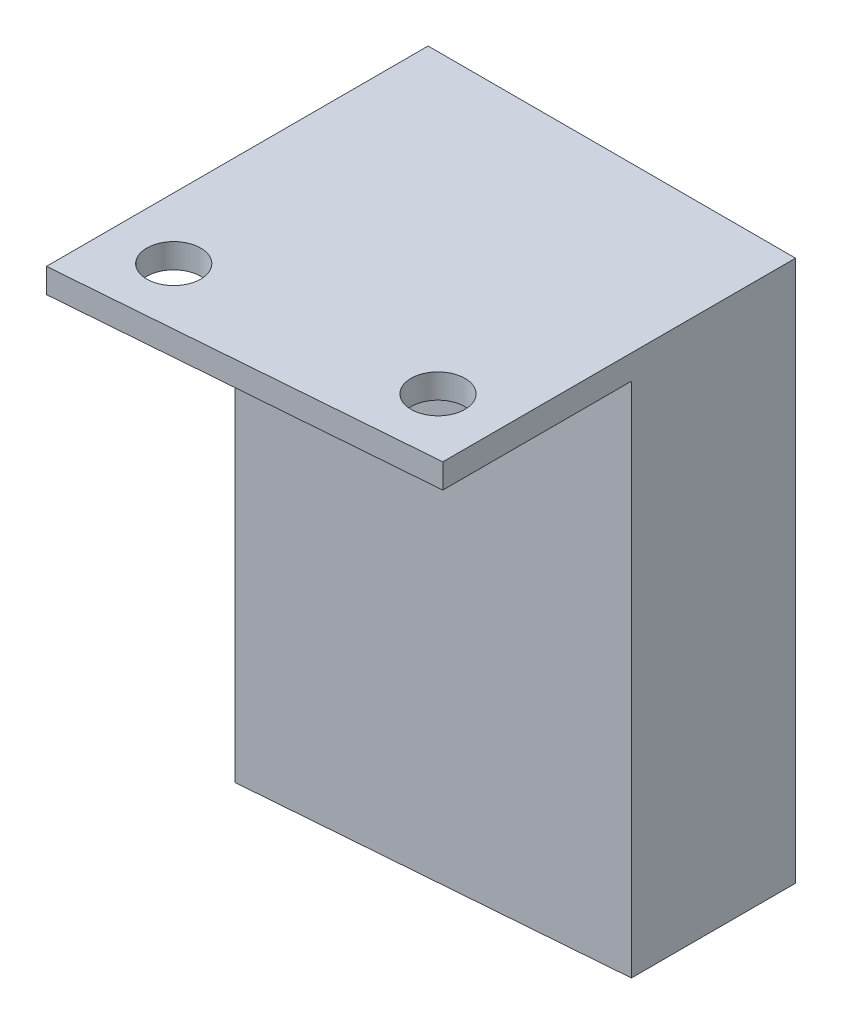
ISO-10303-21;
HEADER;
FILE_DESCRIPTION(('STEP AP214'),'2;1');
FILE_NAME('part.step','',(''),(''),'','','');
FILE_SCHEMA(('AUTOMOTIVE_DESIGN { 1 0 10303 214 1 1 1 1 }'));
ENDSEC;
DATA;
#1=APPLICATION_CONTEXT('core data for automotive mechanical design processes');
#2=APPLICATION_PROTOCOL_DEFINITION('international standard','automotive_design',2000,#1);
#3=PRODUCT_CONTEXT('',#1,'mechanical');
#4=PRODUCT('Part','Part','',(#3));
#5=PRODUCT_RELATED_PRODUCT_CATEGORY('part','',(#4));
#6=PRODUCT_DEFINITION_FORMATION('','',#4);
#7=PRODUCT_DEFINITION_CONTEXT('part definition',#1,'design');
#8=PRODUCT_DEFINITION('design','',#6,#7);
#9=PRODUCT_DEFINITION_SHAPE('','',#8);
#10=(LENGTH_UNIT() NAMED_UNIT(*) SI_UNIT(.MILLI.,.METRE.));
#11=(NAMED_UNIT(*) PLANE_ANGLE_UNIT() SI_UNIT($,.RADIAN.));
#12=(NAMED_UNIT(*) SI_UNIT($,.STERADIAN.) SOLID_ANGLE_UNIT());
#13=UNCERTAINTY_MEASURE_WITH_UNIT(LENGTH_MEASURE(1.E-05),#10,'distance_accuracy_value','');
#14=(GEOMETRIC_REPRESENTATION_CONTEXT(3) GLOBAL_UNCERTAINTY_ASSIGNED_CONTEXT((#13)) GLOBAL_UNIT_ASSIGNED_CONTEXT((#10,
#11,#12)) REPRESENTATION_CONTEXT('',''));
#15=CARTESIAN_POINT('',(0.,0.,0.));
#16=DIRECTION('',(0.,0.,1.));
#17=DIRECTION('',(1.,0.,0.));
#18=AXIS2_PLACEMENT_3D('',#15,#16,#17);
#19=CARTESIAN_POINT('',(0.,0.,17.018));
#20=DIRECTION('',(1.,0.,0.));
#21=DIRECTION('',(0.,0.,-1.));
#22=AXIS2_PLACEMENT_3D('',#19,#20,#21);
#23=PLANE('',#22);
#24=DIRECTION('',(0.,0.,-1.));
#25=VECTOR('',#24,1.);
#26=CARTESIAN_POINT('',(0.,-30.734,0.));
#27=LINE('',#26,#25);
#28=CARTESIAN_POINT('',(0.,-30.734,20.0165350300177));
#29=VERTEX_POINT('',#28);
#30=CARTESIAN_POINT('',(0.,-30.734,0.));
#31=VERTEX_POINT('',#30);
#32=EDGE_CURVE('E112',#29,#31,#27,.T.);
#33=ORIENTED_EDGE('',*,*,#32,.F.);
#34=DIRECTION('',(0.,-1.,0.));
#35=VECTOR('',#34,1.);
#36=CARTESIAN_POINT('',(0.,22.86,20.0165350300177));
#37=LINE('',#36,#35);
#38=CARTESIAN_POINT('',(0.,22.86,20.0165350300177));
#39=VERTEX_POINT('',#38);
#40=EDGE_CURVE('E118',#39,#29,#37,.T.);
#41=ORIENTED_EDGE('',*,*,#40,.F.);
#42=DIRECTION('',(0.,0.,1.));
#43=VECTOR('',#42,1.);
#44=CARTESIAN_POINT('',(0.,22.86,17.018));
#45=LINE('',#44,#43);
#46=CARTESIAN_POINT('',(0.,22.86,39.5745350300181));
#47=VERTEX_POINT('',#46);
#48=EDGE_CURVE('E49',#39,#47,#45,.T.);
#49=ORIENTED_EDGE('',*,*,#48,.T.);
#50=DIRECTION('',(0.,1.,0.));
#51=VECTOR('',#50,1.);
#52=CARTESIAN_POINT('',(0.,-2.50000000007189E-05,39.5745350300181));
#53=LINE('',#52,#51);
#54=CARTESIAN_POINT('',(0.,25.4,39.5745350300181));
#55=VERTEX_POINT('',#54);
#56=EDGE_CURVE('E123',#47,#55,#53,.T.);
#57=ORIENTED_EDGE('',*,*,#56,.T.);
#58=DIRECTION('',(0.,0.,-1.));
#59=VECTOR('',#58,1.);
#60=CARTESIAN_POINT('',(0.,25.4,17.018));
#61=LINE('',#60,#59);
#62=CARTESIAN_POINT('',(0.,25.4,0.));
#63=VERTEX_POINT('',#62);
#64=EDGE_CURVE('E55',#55,#63,#61,.T.);
#65=ORIENTED_EDGE('',*,*,#64,.T.);
#66=DIRECTION('',(0.,-1.,0.));
#67=VECTOR('',#66,1.);
#68=CARTESIAN_POINT('',(0.,0.,0.));
#69=LINE('',#68,#67);
#70=EDGE_CURVE('E97',#63,#31,#69,.T.);
#71=ORIENTED_EDGE('',*,*,#70,.T.);
#72=EDGE_LOOP('',(#33,#41,#49,#57,#65,#71));
#73=FACE_BOUND('',#72,.T.);
#74=ADVANCED_FACE('F33',(#73),#23,.F.);
#75=CARTESIAN_POINT('',(38.1,0.,17.018));
#76=DIRECTION('',(-1.,0.,0.));
#77=DIRECTION('',(0.,-1.,0.));
#78=AXIS2_PLACEMENT_3D('',#75,#76,#77);
#79=PLANE('',#78);
#80=DIRECTION('',(0.,1.,0.));
#81=VECTOR('',#80,1.);
#82=CARTESIAN_POINT('',(38.1,0.,0.));
#83=LINE('',#82,#81);
#84=CARTESIAN_POINT('',(38.1,-30.734,0.));
#85=VERTEX_POINT('',#84);
#86=CARTESIAN_POINT('',(38.1,25.4,0.));
#87=VERTEX_POINT('',#86);
#88=EDGE_CURVE('E87',#85,#87,#83,.T.);
#89=ORIENTED_EDGE('',*,*,#88,.T.);
#90=DIRECTION('',(0.,0.,-1.));
#91=VECTOR('',#90,1.);
#92=CARTESIAN_POINT('',(38.1,25.4,17.018));
#93=LINE('',#92,#91);
#94=CARTESIAN_POINT('',(38.1,25.4,36.576));
#95=VERTEX_POINT('',#94);
#96=EDGE_CURVE('E41',#95,#87,#93,.T.);
#97=ORIENTED_EDGE('',*,*,#96,.F.);
#98=DIRECTION('',(0.,1.,0.));
#99=VECTOR('',#98,1.);
#100=CARTESIAN_POINT('',(38.1,-2.50000000007189E-05,36.576));
#101=LINE('',#100,#99);
#102=CARTESIAN_POINT('',(38.1,22.86,36.576));
#103=VERTEX_POINT('',#102);
#104=EDGE_CURVE('E122',#103,#95,#101,.T.);
#105=ORIENTED_EDGE('',*,*,#104,.F.);
#106=DIRECTION('',(0.,0.,-1.));
#107=VECTOR('',#106,1.);
#108=CARTESIAN_POINT('',(38.1,22.86,17.018));
#109=LINE('',#108,#107);
#110=CARTESIAN_POINT('',(38.1,22.86,17.018));
#111=VERTEX_POINT('',#110);
#112=EDGE_CURVE('E149',#103,#111,#109,.T.);
#113=ORIENTED_EDGE('',*,*,#112,.T.);
#114=DIRECTION('',(0.,1.,0.));
#115=VECTOR('',#114,1.);
#116=CARTESIAN_POINT('',(38.1,0.,17.018));
#117=LINE('',#116,#115);
#118=CARTESIAN_POINT('',(38.1,-30.734,17.018));
#119=VERTEX_POINT('',#118);
#120=EDGE_CURVE('E103',#119,#111,#117,.T.);
#121=ORIENTED_EDGE('',*,*,#120,.F.);
#122=DIRECTION('',(0.,0.,1.));
#123=VECTOR('',#122,1.);
#124=CARTESIAN_POINT('',(38.1,-30.734,17.018));
#125=LINE('',#124,#123);
#126=EDGE_CURVE('E100',#85,#119,#125,.T.);
#127=ORIENTED_EDGE('',*,*,#126,.F.);
#128=EDGE_LOOP('',(#89,#97,#105,#113,#121,#127));
#129=FACE_BOUND('',#128,.T.);
#130=ADVANCED_FACE('F101',(#129),#79,.F.);
#131=CARTESIAN_POINT('',(0.,25.4,17.018));
#132=DIRECTION('',(0.,-1.,0.));
#133=DIRECTION('',(0.,0.,-1.));
#134=AXIS2_PLACEMENT_3D('',#131,#132,#133);
#135=PLANE('',#134);
#136=ORIENTED_EDGE('',*,*,#64,.F.);
#137=DIRECTION('',(-0.996917333733128,0.,0.0784590957278491));
#138=VECTOR('',#137,1.);
#139=CARTESIAN_POINT('',(38.1,25.4,36.576));
#140=LINE('',#139,#138);
#141=EDGE_CURVE('E120',#95,#55,#140,.T.);
#142=ORIENTED_EDGE('',*,*,#141,.F.);
#143=ORIENTED_EDGE('',*,*,#96,.T.);
#144=DIRECTION('',(-1.,0.,0.));
#145=VECTOR('',#144,1.);
#146=CARTESIAN_POINT('',(0.,25.4,0.));
#147=LINE('',#146,#145);
#148=EDGE_CURVE('E93',#87,#63,#147,.T.);
#149=ORIENTED_EDGE('',*,*,#148,.T.);
#150=EDGE_LOOP('',(#136,#142,#143,#149));
#151=FACE_BOUND('',#150,.T.);
#152=CARTESIAN_POINT('',(31.75,25.4,30.7257558383362));
#153=DIRECTION('',(0.,1.,0.));
#154=DIRECTION('',(0.,0.,1.));
#155=AXIS2_PLACEMENT_3D('',#152,#153,#154);
#156=CIRCLE('',#155,2.794);
#157=CARTESIAN_POINT('',(31.75,25.4,33.5197558383362));
#158=VERTEX_POINT('',#157);
#159=EDGE_CURVE('E125',#158,#158,#156,.T.);
#160=ORIENTED_EDGE('',*,*,#159,.F.);
#161=EDGE_LOOP('',(#160));
#162=FACE_BOUND('',#161,.T.);
#163=CARTESIAN_POINT('',(6.35,25.4,32.7247791916812));
#164=DIRECTION('',(0.,1.,0.));
#165=DIRECTION('',(0.,0.,1.));
#166=AXIS2_PLACEMENT_3D('',#163,#164,#165);
#167=CIRCLE('',#166,2.794);
#168=CARTESIAN_POINT('',(6.35,25.4,35.5187791916812));
#169=VERTEX_POINT('',#168);
#170=EDGE_CURVE('E130',#169,#169,#167,.T.);
#171=ORIENTED_EDGE('',*,*,#170,.F.);
#172=EDGE_LOOP('',(#171));
#173=FACE_BOUND('',#172,.T.);
#174=ADVANCED_FACE('F163',(#151,#162,#173),#135,.F.);
#175=CARTESIAN_POINT('',(0.,0.,0.));
#176=DIRECTION('',(0.,0.,-1.));
#177=DIRECTION('',(-1.,0.,0.));
#178=AXIS2_PLACEMENT_3D('',#175,#176,#177);
#179=PLANE('',#178);
#180=DIRECTION('',(1.,0.,0.));
#181=VECTOR('',#180,1.);
#182=CARTESIAN_POINT('',(38.1,-30.734,0.));
#183=LINE('',#182,#181);
#184=EDGE_CURVE('E92',#31,#85,#183,.T.);
#185=ORIENTED_EDGE('',*,*,#184,.F.);
#186=ORIENTED_EDGE('',*,*,#70,.F.);
#187=ORIENTED_EDGE('',*,*,#148,.F.);
#188=ORIENTED_EDGE('',*,*,#88,.F.);
#189=EDGE_LOOP('',(#185,#186,#187,#188));
#190=FACE_BOUND('',#189,.T.);
#191=ADVANCED_FACE('F89',(#190),#179,.T.);
#192=CARTESIAN_POINT('',(0.,22.86,0.));
#193=DIRECTION('',(0.,1.,0.));
#194=DIRECTION('',(0.,0.,1.));
#195=AXIS2_PLACEMENT_3D('',#192,#193,#194);
#196=PLANE('',#195);
#197=CARTESIAN_POINT('',(31.75,22.86,30.7257558383362));
#198=DIRECTION('',(0.,1.,0.));
#199=DIRECTION('',(0.,0.,1.));
#200=AXIS2_PLACEMENT_3D('',#197,#198,#199);
#201=CIRCLE('',#200,2.794);
#202=CARTESIAN_POINT('',(31.75,22.86,33.5197558383362));
#203=VERTEX_POINT('',#202);
#204=EDGE_CURVE('E127',#203,#203,#201,.T.);
#205=ORIENTED_EDGE('',*,*,#204,.T.);
#206=EDGE_LOOP('',(#205));
#207=FACE_BOUND('',#206,.T.);
#208=CARTESIAN_POINT('',(6.35,22.86,32.7247791916812));
#209=DIRECTION('',(0.,1.,0.));
#210=DIRECTION('',(0.,0.,1.));
#211=AXIS2_PLACEMENT_3D('',#208,#209,#210);
#212=CIRCLE('',#211,2.794);
#213=CARTESIAN_POINT('',(6.35,22.86,35.5187791916812));
#214=VERTEX_POINT('',#213);
#215=EDGE_CURVE('E133',#214,#214,#212,.T.);
#216=ORIENTED_EDGE('',*,*,#215,.T.);
#217=EDGE_LOOP('',(#216));
#218=FACE_BOUND('',#217,.T.);
#219=ORIENTED_EDGE('',*,*,#48,.F.);
#220=DIRECTION('',(-0.996917333733129,0.,0.0784590957278378));
#221=VECTOR('',#220,1.);
#222=CARTESIAN_POINT('',(38.1,22.86,17.018));
#223=LINE('',#222,#221);
#224=EDGE_CURVE('E117',#111,#39,#223,.T.);
#225=ORIENTED_EDGE('',*,*,#224,.F.);
#226=ORIENTED_EDGE('',*,*,#112,.F.);
#227=DIRECTION('',(-0.996917333733128,0.,0.0784590957278491));
#228=VECTOR('',#227,1.);
#229=CARTESIAN_POINT('',(3.09541060831854,22.86,39.3309209318204));
#230=LINE('',#229,#228);
#231=EDGE_CURVE('E11',#103,#47,#230,.T.);
#232=ORIENTED_EDGE('',*,*,#231,.T.);
#233=EDGE_LOOP('',(#219,#225,#226,#232));
#234=FACE_BOUND('',#233,.T.);
#235=ADVANCED_FACE('F156',(#207,#218,#234),#196,.F.);
#236=CARTESIAN_POINT('',(6.35,22.86,32.7247791916812));
#237=DIRECTION('',(0.,1.,0.));
#238=DIRECTION('',(0.,0.,1.));
#239=AXIS2_PLACEMENT_3D('',#236,#237,#238);
#240=CYLINDRICAL_SURFACE('',#239,2.794);
#241=ORIENTED_EDGE('',*,*,#215,.F.);
#242=EDGE_LOOP('',(#241));
#243=FACE_BOUND('',#242,.T.);
#244=ORIENTED_EDGE('',*,*,#170,.T.);
#245=EDGE_LOOP('',(#244));
#246=FACE_BOUND('',#245,.T.);
#247=ADVANCED_FACE('F178',(#243,#246),#240,.F.);
#248=CARTESIAN_POINT('',(31.75,22.86,30.7257558383362));
#249=DIRECTION('',(0.,1.,0.));
#250=DIRECTION('',(0.,0.,1.));
#251=AXIS2_PLACEMENT_3D('',#248,#249,#250);
#252=CYLINDRICAL_SURFACE('',#251,2.794);
#253=ORIENTED_EDGE('',*,*,#204,.F.);
#254=EDGE_LOOP('',(#253));
#255=FACE_BOUND('',#254,.T.);
#256=ORIENTED_EDGE('',*,*,#159,.T.);
#257=EDGE_LOOP('',(#256));
#258=FACE_BOUND('',#257,.T.);
#259=ADVANCED_FACE('F182',(#255,#258),#252,.F.);
#260=CARTESIAN_POINT('',(38.1,-2.50000000007189E-05,36.576));
#261=DIRECTION('',(-0.0784590957278491,0.,-0.996917333733128));
#262=DIRECTION('',(-0.996917333733128,0.,0.0784590957278491));
#263=AXIS2_PLACEMENT_3D('',#260,#261,#262);
#264=PLANE('',#263);
#265=ORIENTED_EDGE('',*,*,#104,.T.);
#266=ORIENTED_EDGE('',*,*,#141,.T.);
#267=ORIENTED_EDGE('',*,*,#56,.F.);
#268=ORIENTED_EDGE('',*,*,#231,.F.);
#269=EDGE_LOOP('',(#265,#266,#267,#268));
#270=FACE_BOUND('',#269,.T.);
#271=ADVANCED_FACE('F159',(#270),#264,.F.);
#272=CARTESIAN_POINT('',(38.1,22.86,17.018));
#273=DIRECTION('',(0.0784590957278378,0.,0.996917333733128));
#274=DIRECTION('',(0.996917333733129,0.,-0.0784590957278378));
#275=AXIS2_PLACEMENT_3D('',#272,#273,#274);
#276=PLANE('',#275);
#277=ORIENTED_EDGE('',*,*,#120,.T.);
#278=ORIENTED_EDGE('',*,*,#224,.T.);
#279=ORIENTED_EDGE('',*,*,#40,.T.);
#280=DIRECTION('',(-0.996917333733129,0.,0.0784590957278378));
#281=VECTOR('',#280,1.);
#282=CARTESIAN_POINT('',(0.,-30.734,20.0165350300177));
#283=LINE('',#282,#281);
#284=EDGE_CURVE('E107',#119,#29,#283,.T.);
#285=ORIENTED_EDGE('',*,*,#284,.F.);
#286=EDGE_LOOP('',(#277,#278,#279,#285));
#287=FACE_BOUND('',#286,.T.);
#288=ADVANCED_FACE('F153',(#287),#276,.T.);
#289=CARTESIAN_POINT('',(0.,-30.734,0.));
#290=DIRECTION('',(0.,1.,0.));
#291=DIRECTION('',(0.,0.,1.));
#292=AXIS2_PLACEMENT_3D('',#289,#290,#291);
#293=PLANE('',#292);
#294=ORIENTED_EDGE('',*,*,#184,.T.);
#295=ORIENTED_EDGE('',*,*,#126,.T.);
#296=ORIENTED_EDGE('',*,*,#284,.T.);
#297=ORIENTED_EDGE('',*,*,#32,.T.);
#298=EDGE_LOOP('',(#294,#295,#296,#297));
#299=FACE_BOUND('',#298,.T.);
#300=ADVANCED_FACE('F110',(#299),#293,.F.);
#301=CLOSED_SHELL('',(#74,#130,#174,#191,#235,#247,#259,#271,#288,#300));
#302=MANIFOLD_SOLID_BREP('B2',#301);
#303=ADVANCED_BREP_SHAPE_REPRESENTATION('',(#18,#302),#14);
#304=SHAPE_DEFINITION_REPRESENTATION(#9,#303);
ENDSEC;
END-ISO-10303-21;
